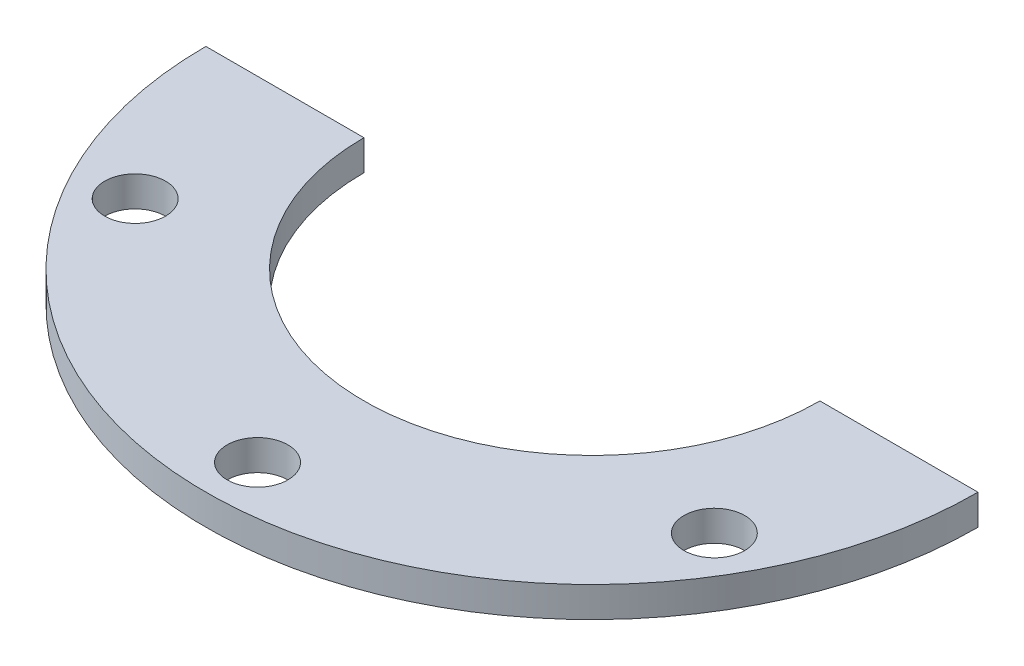
ISO-10303-21;
HEADER;
FILE_DESCRIPTION(('STEP AP214'),'2;1');
FILE_NAME('part.step','',(''),(''),'','','');
FILE_SCHEMA(('AUTOMOTIVE_DESIGN { 1 0 10303 214 1 1 1 1 }'));
ENDSEC;
DATA;
#1=APPLICATION_CONTEXT('core data for automotive mechanical design processes');
#2=APPLICATION_PROTOCOL_DEFINITION('international standard','automotive_design',2000,#1);
#3=PRODUCT_CONTEXT('',#1,'mechanical');
#4=PRODUCT('Part','Part','',(#3));
#5=PRODUCT_RELATED_PRODUCT_CATEGORY('part','',(#4));
#6=PRODUCT_DEFINITION_FORMATION('','',#4);
#7=PRODUCT_DEFINITION_CONTEXT('part definition',#1,'design');
#8=PRODUCT_DEFINITION('design','',#6,#7);
#9=PRODUCT_DEFINITION_SHAPE('','',#8);
#10=(LENGTH_UNIT() NAMED_UNIT(*) SI_UNIT(.MILLI.,.METRE.));
#11=(NAMED_UNIT(*) PLANE_ANGLE_UNIT() SI_UNIT($,.RADIAN.));
#12=(NAMED_UNIT(*) SI_UNIT($,.STERADIAN.) SOLID_ANGLE_UNIT());
#13=UNCERTAINTY_MEASURE_WITH_UNIT(LENGTH_MEASURE(1.E-05),#10,'distance_accuracy_value','');
#14=(GEOMETRIC_REPRESENTATION_CONTEXT(3) GLOBAL_UNCERTAINTY_ASSIGNED_CONTEXT((#13)) GLOBAL_UNIT_ASSIGNED_CONTEXT((#10,
#11,#12)) REPRESENTATION_CONTEXT('',''));
#15=CARTESIAN_POINT('',(0.,0.,0.));
#16=DIRECTION('',(0.,0.,1.));
#17=DIRECTION('',(1.,0.,0.));
#18=AXIS2_PLACEMENT_3D('',#15,#16,#17);
#19=CARTESIAN_POINT('',(0.,1.,0.));
#20=DIRECTION('',(0.,-1.,0.));
#21=DIRECTION('',(0.,0.,-1.));
#22=AXIS2_PLACEMENT_3D('',#19,#20,#21);
#23=CYLINDRICAL_SURFACE('',#22,12.7);
#24=CARTESIAN_POINT('',(0.,1.,0.));
#25=DIRECTION('',(0.,1.,0.));
#26=DIRECTION('',(0.,0.,1.));
#27=AXIS2_PLACEMENT_3D('',#24,#25,#26);
#28=CIRCLE('',#27,12.7);
#29=CARTESIAN_POINT('',(-12.7,1.,0.));
#30=VERTEX_POINT('',#29);
#31=CARTESIAN_POINT('',(12.7,1.,0.));
#32=VERTEX_POINT('',#31);
#33=EDGE_CURVE('E76',#30,#32,#28,.T.);
#34=ORIENTED_EDGE('',*,*,#33,.F.);
#35=DIRECTION('',(0.,-1.,0.));
#36=VECTOR('',#35,1.);
#37=CARTESIAN_POINT('',(-12.7,1.,0.));
#38=LINE('',#37,#36);
#39=CARTESIAN_POINT('',(-12.7,0.,0.));
#40=VERTEX_POINT('',#39);
#41=EDGE_CURVE('E118',#30,#40,#38,.T.);
#42=ORIENTED_EDGE('',*,*,#41,.T.);
#43=CARTESIAN_POINT('',(0.,0.,0.));
#44=DIRECTION('',(0.,1.,0.));
#45=DIRECTION('',(0.,0.,1.));
#46=AXIS2_PLACEMENT_3D('',#43,#44,#45);
#47=CIRCLE('',#46,12.7);
#48=CARTESIAN_POINT('',(12.7,0.,0.));
#49=VERTEX_POINT('',#48);
#50=EDGE_CURVE('E84',#40,#49,#47,.T.);
#51=ORIENTED_EDGE('',*,*,#50,.T.);
#52=DIRECTION('',(0.,-1.,0.));
#53=VECTOR('',#52,1.);
#54=CARTESIAN_POINT('',(12.7,1.,0.));
#55=LINE('',#54,#53);
#56=EDGE_CURVE('E88',#49,#32,#55,.F.);
#57=ORIENTED_EDGE('',*,*,#56,.T.);
#58=EDGE_LOOP('',(#34,#42,#51,#57));
#59=FACE_BOUND('',#58,.T.);
#60=ADVANCED_FACE('F32',(#59),#23,.T.);
#61=CARTESIAN_POINT('',(0.,1.,0.));
#62=DIRECTION('',(0.,1.,0.));
#63=DIRECTION('',(0.,0.,1.));
#64=AXIS2_PLACEMENT_3D('',#61,#62,#63);
#65=PLANE('',#64);
#66=DIRECTION('',(1.,0.,0.));
#67=VECTOR('',#66,1.);
#68=CARTESIAN_POINT('',(0.,1.,0.));
#69=LINE('',#68,#67);
#70=CARTESIAN_POINT('',(-7.5,1.,0.));
#71=VERTEX_POINT('',#70);
#72=EDGE_CURVE('E53',#30,#71,#69,.T.);
#73=ORIENTED_EDGE('',*,*,#72,.F.);
#74=ORIENTED_EDGE('',*,*,#33,.T.);
#75=CARTESIAN_POINT('',(7.5,1.,0.));
#76=VERTEX_POINT('',#75);
#77=EDGE_CURVE('E93',#76,#32,#69,.T.);
#78=ORIENTED_EDGE('',*,*,#77,.F.);
#79=CARTESIAN_POINT('',(0.,1.,0.));
#80=DIRECTION('',(0.,1.,0.));
#81=DIRECTION('',(0.,0.,1.));
#82=AXIS2_PLACEMENT_3D('',#79,#80,#81);
#83=CIRCLE('',#82,7.5);
#84=EDGE_CURVE('E87',#71,#76,#83,.T.);
#85=ORIENTED_EDGE('',*,*,#84,.F.);
#86=EDGE_LOOP('',(#73,#74,#78,#85));
#87=FACE_BOUND('',#86,.T.);
#88=CARTESIAN_POINT('',(-9.52627944162847,1.,5.4999999999998));
#89=DIRECTION('',(0.,1.,0.));
#90=DIRECTION('',(0.,0.,1.));
#91=AXIS2_PLACEMENT_3D('',#88,#89,#90);
#92=CIRCLE('',#91,1.00000000000035);
#93=CARTESIAN_POINT('',(-9.52627944162847,1.,6.50000000000015));
#94=VERTEX_POINT('',#93);
#95=EDGE_CURVE('E111',#94,#94,#92,.T.);
#96=ORIENTED_EDGE('',*,*,#95,.F.);
#97=EDGE_LOOP('',(#96));
#98=FACE_BOUND('',#97,.T.);
#99=CARTESIAN_POINT('',(2.32162478298628E-13,1.,10.9999999999996));
#100=DIRECTION('',(0.,1.,0.));
#101=DIRECTION('',(0.,0.,1.));
#102=AXIS2_PLACEMENT_3D('',#99,#100,#101);
#103=CIRCLE('',#102,1.00000000000022);
#104=CARTESIAN_POINT('',(2.32162478298628E-13,1.,11.9999999999998));
#105=VERTEX_POINT('',#104);
#106=EDGE_CURVE('E108',#105,#105,#103,.T.);
#107=ORIENTED_EDGE('',*,*,#106,.F.);
#108=EDGE_LOOP('',(#107));
#109=FACE_BOUND('',#108,.T.);
#110=CARTESIAN_POINT('',(9.52627944162882,1.,5.4999999999996));
#111=DIRECTION('',(0.,1.,0.));
#112=DIRECTION('',(0.,0.,1.));
#113=AXIS2_PLACEMENT_3D('',#110,#111,#112);
#114=CIRCLE('',#113,1.00000000000043);
#115=CARTESIAN_POINT('',(9.52627944162882,1.,6.50000000000003));
#116=VERTEX_POINT('',#115);
#117=EDGE_CURVE('E103',#116,#116,#114,.T.);
#118=ORIENTED_EDGE('',*,*,#117,.F.);
#119=EDGE_LOOP('',(#118));
#120=FACE_BOUND('',#119,.T.);
#121=ADVANCED_FACE('F123',(#87,#98,#109,#120),#65,.T.);
#122=CARTESIAN_POINT('',(0.,0.,0.));
#123=DIRECTION('',(0.,1.,0.));
#124=DIRECTION('',(0.,0.,1.));
#125=AXIS2_PLACEMENT_3D('',#122,#123,#124);
#126=PLANE('',#125);
#127=ORIENTED_EDGE('',*,*,#50,.F.);
#128=DIRECTION('',(1.,0.,0.));
#129=VECTOR('',#128,1.);
#130=CARTESIAN_POINT('',(0.,0.,0.));
#131=LINE('',#130,#129);
#132=CARTESIAN_POINT('',(-7.5,0.,0.));
#133=VERTEX_POINT('',#132);
#134=EDGE_CURVE('E70',#40,#133,#131,.T.);
#135=ORIENTED_EDGE('',*,*,#134,.T.);
#136=CARTESIAN_POINT('',(0.,0.,0.));
#137=DIRECTION('',(0.,1.,0.));
#138=DIRECTION('',(0.,0.,1.));
#139=AXIS2_PLACEMENT_3D('',#136,#137,#138);
#140=CIRCLE('',#139,7.5);
#141=CARTESIAN_POINT('',(7.5,0.,0.));
#142=VERTEX_POINT('',#141);
#143=EDGE_CURVE('E82',#133,#142,#140,.T.);
#144=ORIENTED_EDGE('',*,*,#143,.T.);
#145=EDGE_CURVE('E46',#142,#49,#131,.T.);
#146=ORIENTED_EDGE('',*,*,#145,.T.);
#147=EDGE_LOOP('',(#127,#135,#144,#146));
#148=FACE_BOUND('',#147,.T.);
#149=CARTESIAN_POINT('',(-9.52627944162847,0.,5.4999999999998));
#150=DIRECTION('',(0.,1.,0.));
#151=DIRECTION('',(0.,0.,1.));
#152=AXIS2_PLACEMENT_3D('',#149,#150,#151);
#153=CIRCLE('',#152,1.00000000000035);
#154=CARTESIAN_POINT('',(-9.52627944162847,0.,6.50000000000015));
#155=VERTEX_POINT('',#154);
#156=EDGE_CURVE('E90',#155,#155,#153,.T.);
#157=ORIENTED_EDGE('',*,*,#156,.T.);
#158=EDGE_LOOP('',(#157));
#159=FACE_BOUND('',#158,.T.);
#160=CARTESIAN_POINT('',(2.32162478298628E-13,0.,10.9999999999996));
#161=DIRECTION('',(0.,1.,0.));
#162=DIRECTION('',(0.,0.,1.));
#163=AXIS2_PLACEMENT_3D('',#160,#161,#162);
#164=CIRCLE('',#163,1.00000000000022);
#165=CARTESIAN_POINT('',(2.32162478298628E-13,0.,11.9999999999998));
#166=VERTEX_POINT('',#165);
#167=EDGE_CURVE('E99',#166,#166,#164,.T.);
#168=ORIENTED_EDGE('',*,*,#167,.T.);
#169=EDGE_LOOP('',(#168));
#170=FACE_BOUND('',#169,.T.);
#171=CARTESIAN_POINT('',(9.52627944162882,0.,5.4999999999996));
#172=DIRECTION('',(0.,1.,0.));
#173=DIRECTION('',(0.,0.,1.));
#174=AXIS2_PLACEMENT_3D('',#171,#172,#173);
#175=CIRCLE('',#174,1.00000000000043);
#176=CARTESIAN_POINT('',(9.52627944162882,0.,6.50000000000003));
#177=VERTEX_POINT('',#176);
#178=EDGE_CURVE('E100',#177,#177,#175,.T.);
#179=ORIENTED_EDGE('',*,*,#178,.T.);
#180=EDGE_LOOP('',(#179));
#181=FACE_BOUND('',#180,.T.);
#182=ADVANCED_FACE('F80',(#148,#159,#170,#181),#126,.F.);
#183=CARTESIAN_POINT('',(9.52627944162882,0.,5.4999999999996));
#184=DIRECTION('',(0.,1.,0.));
#185=DIRECTION('',(0.,0.,1.));
#186=AXIS2_PLACEMENT_3D('',#183,#184,#185);
#187=CYLINDRICAL_SURFACE('',#186,1.00000000000043);
#188=ORIENTED_EDGE('',*,*,#117,.T.);
#189=EDGE_LOOP('',(#188));
#190=FACE_BOUND('',#189,.T.);
#191=ORIENTED_EDGE('',*,*,#178,.F.);
#192=EDGE_LOOP('',(#191));
#193=FACE_BOUND('',#192,.T.);
#194=ADVANCED_FACE('F133',(#190,#193),#187,.F.);
#195=CARTESIAN_POINT('',(2.32162478298628E-13,0.,10.9999999999996));
#196=DIRECTION('',(0.,1.,0.));
#197=DIRECTION('',(0.,0.,1.));
#198=AXIS2_PLACEMENT_3D('',#195,#196,#197);
#199=CYLINDRICAL_SURFACE('',#198,1.00000000000022);
#200=ORIENTED_EDGE('',*,*,#106,.T.);
#201=EDGE_LOOP('',(#200));
#202=FACE_BOUND('',#201,.T.);
#203=ORIENTED_EDGE('',*,*,#167,.F.);
#204=EDGE_LOOP('',(#203));
#205=FACE_BOUND('',#204,.T.);
#206=ADVANCED_FACE('F136',(#202,#205),#199,.F.);
#207=CARTESIAN_POINT('',(-9.52627944162847,0.,5.4999999999998));
#208=DIRECTION('',(0.,1.,0.));
#209=DIRECTION('',(0.,0.,1.));
#210=AXIS2_PLACEMENT_3D('',#207,#208,#209);
#211=CYLINDRICAL_SURFACE('',#210,1.00000000000035);
#212=ORIENTED_EDGE('',*,*,#95,.T.);
#213=EDGE_LOOP('',(#212));
#214=FACE_BOUND('',#213,.T.);
#215=ORIENTED_EDGE('',*,*,#156,.F.);
#216=EDGE_LOOP('',(#215));
#217=FACE_BOUND('',#216,.T.);
#218=ADVANCED_FACE('F165',(#214,#217),#211,.F.);
#219=CARTESIAN_POINT('',(0.,0.,0.));
#220=DIRECTION('',(0.,1.,0.));
#221=DIRECTION('',(0.,0.,1.));
#222=AXIS2_PLACEMENT_3D('',#219,#220,#221);
#223=CYLINDRICAL_SURFACE('',#222,7.5);
#224=ORIENTED_EDGE('',*,*,#84,.T.);
#225=DIRECTION('',(0.,1.,0.));
#226=VECTOR('',#225,1.);
#227=CARTESIAN_POINT('',(7.5,0.,0.));
#228=LINE('',#227,#226);
#229=EDGE_CURVE('E11',#76,#142,#228,.F.);
#230=ORIENTED_EDGE('',*,*,#229,.T.);
#231=ORIENTED_EDGE('',*,*,#143,.F.);
#232=DIRECTION('',(0.,1.,0.));
#233=VECTOR('',#232,1.);
#234=CARTESIAN_POINT('',(-7.5,0.,0.));
#235=LINE('',#234,#233);
#236=EDGE_CURVE('E39',#133,#71,#235,.T.);
#237=ORIENTED_EDGE('',*,*,#236,.T.);
#238=EDGE_LOOP('',(#224,#230,#231,#237));
#239=FACE_BOUND('',#238,.T.);
#240=ADVANCED_FACE('F86',(#239),#223,.F.);
#241=CARTESIAN_POINT('',(0.,0.,0.));
#242=DIRECTION('',(0.,0.,1.));
#243=DIRECTION('',(1.,0.,0.));
#244=AXIS2_PLACEMENT_3D('',#241,#242,#243);
#245=PLANE('',#244);
#246=ORIENTED_EDGE('',*,*,#72,.T.);
#247=ORIENTED_EDGE('',*,*,#236,.F.);
#248=ORIENTED_EDGE('',*,*,#134,.F.);
#249=ORIENTED_EDGE('',*,*,#41,.F.);
#250=EDGE_LOOP('',(#246,#247,#248,#249));
#251=FACE_BOUND('',#250,.T.);
#252=ADVANCED_FACE('F69',(#251),#245,.F.);
#253=ORIENTED_EDGE('',*,*,#145,.F.);
#254=ORIENTED_EDGE('',*,*,#229,.F.);
#255=ORIENTED_EDGE('',*,*,#77,.T.);
#256=ORIENTED_EDGE('',*,*,#56,.F.);
#257=EDGE_LOOP('',(#253,#254,#255,#256));
#258=FACE_BOUND('',#257,.T.);
#259=ADVANCED_FACE('F121',(#258),#245,.F.);
#260=CLOSED_SHELL('',(#60,#121,#182,#194,#206,#218,#240,#252,#259));
#261=MANIFOLD_SOLID_BREP('B2',#260);
#262=ADVANCED_BREP_SHAPE_REPRESENTATION('',(#18,#261),#14);
#263=SHAPE_DEFINITION_REPRESENTATION(#9,#262);
ENDSEC;
END-ISO-10303-21;
